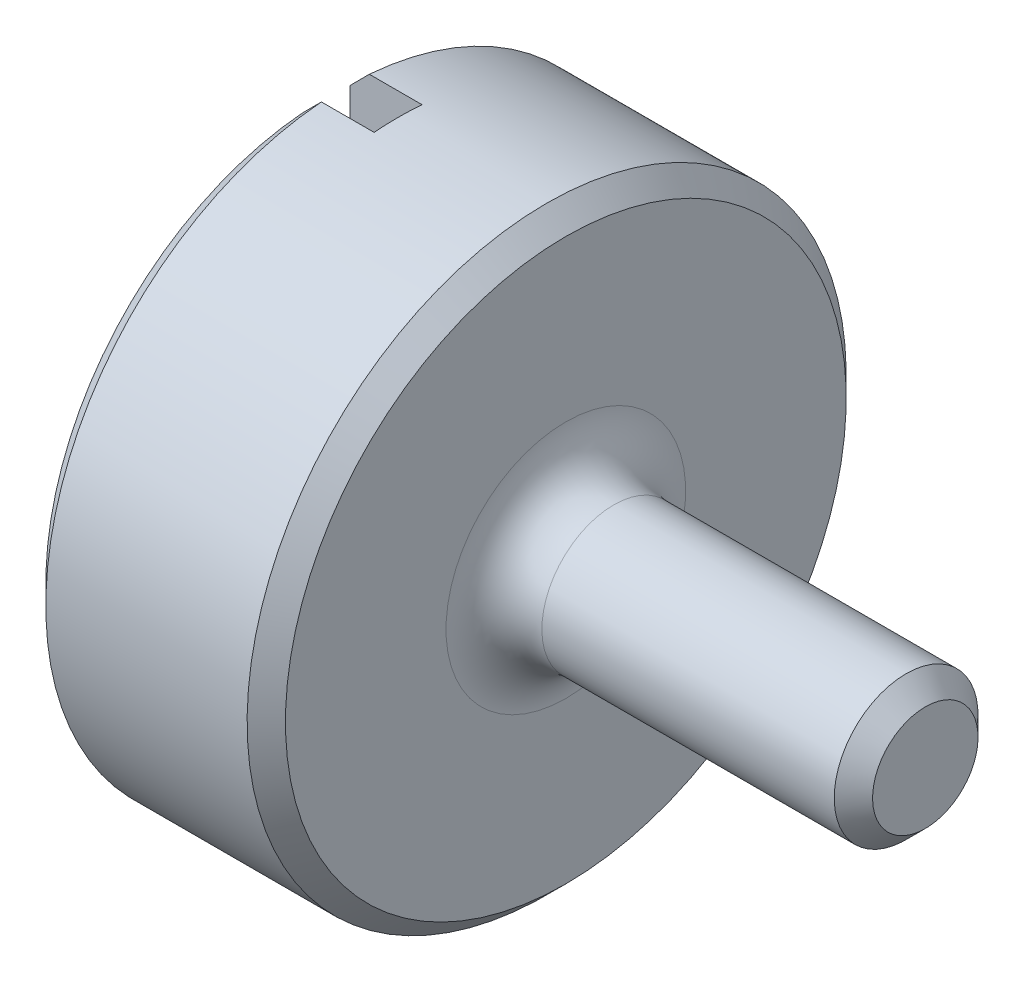
ISO-10303-21;
HEADER;
FILE_DESCRIPTION(('STEP AP214'),'2;1');
FILE_NAME('part.step','',(''),(''),'','','');
FILE_SCHEMA(('AUTOMOTIVE_DESIGN { 1 0 10303 214 1 1 1 1 }'));
ENDSEC;
DATA;
#1=APPLICATION_CONTEXT('core data for automotive mechanical design processes');
#2=APPLICATION_PROTOCOL_DEFINITION('international standard','automotive_design',2000,#1);
#3=PRODUCT_CONTEXT('',#1,'mechanical');
#4=PRODUCT('Part','Part','',(#3));
#5=PRODUCT_RELATED_PRODUCT_CATEGORY('part','',(#4));
#6=PRODUCT_DEFINITION_FORMATION('','',#4);
#7=PRODUCT_DEFINITION_CONTEXT('part definition',#1,'design');
#8=PRODUCT_DEFINITION('design','',#6,#7);
#9=PRODUCT_DEFINITION_SHAPE('','',#8);
#10=(LENGTH_UNIT() NAMED_UNIT(*) SI_UNIT(.MILLI.,.METRE.));
#11=(NAMED_UNIT(*) PLANE_ANGLE_UNIT() SI_UNIT($,.RADIAN.));
#12=(NAMED_UNIT(*) SI_UNIT($,.STERADIAN.) SOLID_ANGLE_UNIT());
#13=UNCERTAINTY_MEASURE_WITH_UNIT(LENGTH_MEASURE(1.E-05),#10,'distance_accuracy_value','');
#14=(GEOMETRIC_REPRESENTATION_CONTEXT(3) GLOBAL_UNCERTAINTY_ASSIGNED_CONTEXT((#13)) GLOBAL_UNIT_ASSIGNED_CONTEXT((#10,
#11,#12)) REPRESENTATION_CONTEXT('',''));
#15=CARTESIAN_POINT('',(0.,0.,0.));
#16=DIRECTION('',(0.,0.,1.));
#17=DIRECTION('',(1.,0.,0.));
#18=AXIS2_PLACEMENT_3D('',#15,#16,#17);
#19=CARTESIAN_POINT('',(0.,0.,0.));
#20=DIRECTION('',(-1.,0.,0.));
#21=DIRECTION('',(0.,-1.,0.));
#22=AXIS2_PLACEMENT_3D('',#19,#20,#21);
#23=PLANE('',#22);
#24=DIRECTION('',(0.,1.,0.));
#25=VECTOR('',#24,1.);
#26=CARTESIAN_POINT('',(0.,-15.,1.));
#27=LINE('',#26,#25);
#28=CARTESIAN_POINT('',(0.,-11.6571866245677,1.));
#29=VERTEX_POINT('',#28);
#30=CARTESIAN_POINT('',(0.,11.6571866245677,1.));
#31=VERTEX_POINT('',#30);
#32=EDGE_CURVE('E92',#29,#31,#27,.T.);
#33=ORIENTED_EDGE('',*,*,#32,.F.);
#34=CARTESIAN_POINT('',(0.,0.,0.));
#35=DIRECTION('',(-1.,0.,0.));
#36=DIRECTION('',(0.,-1.,0.));
#37=AXIS2_PLACEMENT_3D('',#34,#35,#36);
#38=CIRCLE('',#37,11.7);
#39=EDGE_CURVE('E101',#29,#31,#38,.T.);
#40=ORIENTED_EDGE('',*,*,#39,.T.);
#41=EDGE_LOOP('',(#33,#40));
#42=FACE_BOUND('',#41,.T.);
#43=ADVANCED_FACE('F39',(#42),#23,.T.);
#44=CARTESIAN_POINT('',(0.800000000000009,0.,0.));
#45=DIRECTION('',(1.,0.,0.));
#46=DIRECTION('',(0.,1.,0.));
#47=AXIS2_PLACEMENT_3D('',#44,#45,#46);
#48=CONICAL_SURFACE('',#47,12.5,0.785398163397451);
#49=CARTESIAN_POINT('',(15.807878034926,-27.4896954145434,1.));
#50=CARTESIAN_POINT('',(14.8555108146234,-26.536693146937,1.));
#51=CARTESIAN_POINT('',(13.9031715016769,-25.5836629846989,1.));
#52=CARTESIAN_POINT('',(11.9985833649203,-23.677508671348,1.));
#53=CARTESIAN_POINT('',(11.0463345412833,-22.7243845200622,1.));
#54=CARTESIAN_POINT('',(9.14192443533305,-20.8179663651652,1.));
#55=CARTESIAN_POINT('',(8.18976315859005,-19.8646723559894,1.));
#56=CARTESIAN_POINT('',(6.28563973653276,-17.9578889595549,1.));
#57=CARTESIAN_POINT('',(5.33367759085774,-17.0043995726564,1.));
#58=CARTESIAN_POINT('',(3.43645473458549,-15.1035030827972,1.));
#59=CARTESIAN_POINT('',(2.49119191092316,-14.1560980892298,1.));
#60=CARTESIAN_POINT('',(1.07371904234302,-12.7345650808275,1.));
#61=CARTESIAN_POINT('',(0.60129698355512,-12.260648489201,1.));
#62=CARTESIAN_POINT('',(-0.343344665598047,-11.3126140741084,1.));
#63=CARTESIAN_POINT('',(-0.815564256075536,-10.8384962507541,1.));
#64=CARTESIAN_POINT('',(-1.75969684490445,-9.88998054353987,1.));
#65=CARTESIAN_POINT('',(-2.23160985110072,-9.41558266749058,1.));
#66=CARTESIAN_POINT('',(-3.17497918924368,-8.46633104338289,1.));
#67=CARTESIAN_POINT('',(-3.64643552021582,-7.99147729435592,1.));
#68=CARTESIAN_POINT('',(-4.58859457239412,-7.04103122185077,1.));
#69=CARTESIAN_POINT('',(-5.05929730097755,-6.56543890569357,1.));
#70=CARTESIAN_POINT('',(-5.76428341950261,-5.85099794631025,1.));
#71=CARTESIAN_POINT('',(-5.99910039209437,-5.61267595806537,1.));
#72=CARTESIAN_POINT('',(-6.46821135319529,-5.1355179588062,1.));
#73=CARTESIAN_POINT('',(-6.70250534236055,-4.8966819484375,1.));
#74=CARTESIAN_POINT('',(-7.06481216676372,-4.52611496234965,1.));
#75=CARTESIAN_POINT('',(-7.19310419078454,-4.39465701635852,1.));
#76=CARTESIAN_POINT('',(-7.44937260011189,-4.13143310508605,1.));
#77=CARTESIAN_POINT('',(-7.57734898463796,-3.99966713904466,1.));
#78=CARTESIAN_POINT('',(-7.83300381811471,-3.73560676508893,1.));
#79=CARTESIAN_POINT('',(-7.96068187556511,-3.60331197772391,1.));
#80=CARTESIAN_POINT('',(-8.2154590637256,-3.33816767213829,1.));
#81=CARTESIAN_POINT('',(-8.34255819757996,-3.20531815693807,1.));
#82=CARTESIAN_POINT('',(-8.63890915551919,-2.8936809652707,1.));
#83=CARTESIAN_POINT('',(-8.80784266623338,-2.71458917149139,1.));
#84=CARTESIAN_POINT('',(-9.05921024867457,-2.44434894346446,1.));
#85=CARTESIAN_POINT('',(-9.14258907707747,-2.35408092473684,1.));
#86=CARTESIAN_POINT('',(-9.30846010774357,-2.1727407165089,1.));
#87=CARTESIAN_POINT('',(-9.3909523425628,-2.08166855676217,1.));
#88=CARTESIAN_POINT('',(-9.58240572956285,-1.86743064326045,1.));
#89=CARTESIAN_POINT('',(-9.69088316079781,-1.74382771077056,1.));
#90=CARTESIAN_POINT('',(-9.85097604119026,-1.55562239194343,1.));
#91=CARTESIAN_POINT('',(-9.90403721822307,-1.49225254848212,1.));
#92=CARTESIAN_POINT('',(-10.0087852867479,-1.36439004058006,1.));
#93=CARTESIAN_POINT('',(-10.0604722927906,-1.29989747047603,1.));
#94=CARTESIAN_POINT('',(-10.1624354567112,-1.16868824925741,1.));
#95=CARTESIAN_POINT('',(-10.2126906334983,-1.10195519518504,1.));
#96=CARTESIAN_POINT('',(-10.3102743734976,-0.966215584856913,1.));
#97=CARTESIAN_POINT('',(-10.3575989912019,-0.897206147409944,1.));
#98=CARTESIAN_POINT('',(-10.4471567135031,-0.756665935244809,1.));
#99=CARTESIAN_POINT('',(-10.489426101978,-0.685158572077686,1.));
#100=CARTESIAN_POINT('',(-10.5661430226153,-0.538097820372609,1.));
#101=CARTESIAN_POINT('',(-10.6006143053188,-0.462557607670071,1.));
#102=CARTESIAN_POINT('',(-10.6392251726816,-0.354967792280996,1.));
#103=CARTESIAN_POINT('',(-10.6489351484247,-0.324928911583501,1.));
#104=CARTESIAN_POINT('',(-10.6660973338667,-0.264214153066471,1.));
#105=CARTESIAN_POINT('',(-10.6735494683775,-0.233538254069978,1.));
#106=CARTESIAN_POINT('',(-10.6919063164554,-0.140944427066972,1.));
#107=CARTESIAN_POINT('',(-10.6989216057753,-0.0781718405835981,1.));
#108=CARTESIAN_POINT('',(-10.7008486773791,0.0478569629637886,1.));
#109=CARTESIAN_POINT('',(-10.6957013146907,0.111114046174777,1.));
#110=CARTESIAN_POINT('',(-10.6744238041197,0.235861919114412,1.));
#111=CARTESIAN_POINT('',(-10.6582543817528,0.297345570306663,1.));
#112=CARTESIAN_POINT('',(-10.6169329496841,0.420175900562732,1.));
#113=CARTESIAN_POINT('',(-10.5914086725897,0.481391312498021,1.));
#114=CARTESIAN_POINT('',(-10.5344551597917,0.601057449533538,1.));
#115=CARTESIAN_POINT('',(-10.5030149210655,0.659502764831655,1.));
#116=CARTESIAN_POINT('',(-10.4359946962556,0.774538295051341,1.));
#117=CARTESIAN_POINT('',(-10.4003844723781,0.831110589957209,1.));
#118=CARTESIAN_POINT('',(-10.3449870570802,0.914597355009349,1.));
#119=CARTESIAN_POINT('',(-10.3261990299114,0.94218661150767,1.));
#120=CARTESIAN_POINT('',(-10.2880616799861,0.996973875092047,1.));
#121=CARTESIAN_POINT('',(-10.2687123731191,1.02417189322134,1.));
#122=CARTESIAN_POINT('',(-10.206384907135,1.11020140978787,1.));
#123=CARTESIAN_POINT('',(-10.1625295518816,1.16839701885495,1.));
#124=CARTESIAN_POINT('',(-10.0732618131998,1.28358509428769,1.));
#125=CARTESIAN_POINT('',(-10.0278491866867,1.34057737055325,1.));
#126=CARTESIAN_POINT('',(-9.88990105290229,1.51024661668674,1.));
#127=CARTESIAN_POINT('',(-9.79569551651262,1.62156234578438,1.));
#128=CARTESIAN_POINT('',(-9.60460713326796,1.84218976879908,1.));
#129=CARTESIAN_POINT('',(-9.50771982032372,1.95149754390925,1.));
#130=CARTESIAN_POINT('',(-9.31237352548137,2.16864140574841,1.));
#131=CARTESIAN_POINT('',(-9.2139149958505,2.27647789997275,1.));
#132=CARTESIAN_POINT('',(-9.01624589935556,2.49083124071735,1.));
#133=CARTESIAN_POINT('',(-8.91703865838071,2.59735116476431,1.));
#134=CARTESIAN_POINT('',(-8.71787494643918,2.80970174269921,1.));
#135=CARTESIAN_POINT('',(-8.61791842262359,2.91553234696473,1.));
#136=CARTESIAN_POINT('',(-8.41757201418156,3.12656844533748,1.));
#137=CARTESIAN_POINT('',(-8.31718270235786,3.23177448385095,1.));
#138=CARTESIAN_POINT('',(-8.11600081772052,3.44179516554277,1.));
#139=CARTESIAN_POINT('',(-8.01520825465803,3.54660981806826,1.));
#140=CARTESIAN_POINT('',(-7.71325906172983,3.85968428159871,1.));
#141=CARTESIAN_POINT('',(-7.51164563019328,4.06750337618647,1.));
#142=CARTESIAN_POINT('',(-7.10765103010603,4.48239435067646,1.));
#143=CARTESIAN_POINT('',(-6.90526985849305,4.68946622759181,1.));
#144=CARTESIAN_POINT('',(-6.29735872916324,5.30994459715682,1.));
#145=CARTESIAN_POINT('',(-5.8910686812789,5.72260607308193,1.));
#146=CARTESIAN_POINT('',(-5.07729589805776,6.5470947833271,1.));
#147=CARTESIAN_POINT('',(-4.66981273019834,6.95892158993145,1.));
#148=CARTESIAN_POINT('',(-3.85424007487945,7.78196728918696,1.));
#149=CARTESIAN_POINT('',(-3.44615059272825,8.1931861870982,1.));
#150=CARTESIAN_POINT('',(-2.62954690368962,9.01528432110729,1.));
#151=CARTESIAN_POINT('',(-2.22103265809964,9.42616351874364,1.));
#152=CARTESIAN_POINT('',(-1.40374312707324,10.2476640891893,1.));
#153=CARTESIAN_POINT('',(-0.994967841033351,10.6582854613982,1.));
#154=CARTESIAN_POINT('',(0.231520024145323,11.8897725452021,1.));
#155=CARTESIAN_POINT('',(1.04950234000151,12.7103695825016,1.));
#156=CARTESIAN_POINT('',(3.02871000754743,14.694972414817,1.));
#157=CARTESIAN_POINT('',(4.19013045464783,15.8587835934129,1.));
#158=CARTESIAN_POINT('',(6.51341985056264,18.1860712809208,1.));
#159=CARTESIAN_POINT('',(7.67528881846152,19.3495477707782,1.));
#160=CARTESIAN_POINT('',(9.99889214984743,21.6759119122053,1.));
#161=CARTESIAN_POINT('',(11.1606264426887,22.8387996343411,1.));
#162=CARTESIAN_POINT('',(13.484187792837,25.1643687501421,1.));
#163=CARTESIAN_POINT('',(14.6460148428278,26.327050151117,1.));
#164=CARTESIAN_POINT('',(15.807878034926,27.4896954145434,1.));
#165=B_SPLINE_CURVE_WITH_KNOTS('',3,(#49,#50,#51,#52,#53,#54,#55,#56,#57,#58,#59,#60,#61,#62,
#63,#64,#65,#66,#67,#68,#69,#70,#71,#72,#73,#74,#75,#76,#77,#78,#79,#80,#81,#82,#83,#84,#85,#86,
#87,#88,#89,#90,#91,#92,#93,#94,#95,#96,#97,#98,#99,#100,#101,#102,#103,#104,#105,#106,#107,
#108,#109,#110,#111,#112,#113,#114,#115,#116,#117,#118,#119,#120,#121,#122,#123,#124,#125,#126,
#127,#128,#129,#130,#131,#132,#133,#134,#135,#136,#137,#138,#139,#140,#141,#142,#143,#144,#145,
#146,#147,#148,#149,#150,#151,#152,#153,#154,#155,#156,#157,#158,#159,#160,#161,#162,#163,#164),
.UNSPECIFIED.,.F.,.F.,(4,2,2,2,2,2,2,2,2,2,2,2,2,2,2,2,2,2,2,2,2,2,2,2,2,2,2,2,2,2,2,2,2,2,2,2,
2,2,2,2,2,2,2,2,2,2,2,2,2,2,2,2,2,2,2,2,2,4),(0.,4.04189928658942,8.08380616057433,
12.125887915259,16.167962283066,20.1829194401768,22.1904093306113,24.1978981069374,
26.2053333156475,28.2127727988613,30.2201925089327,31.2238988978735,32.2276040269417,
32.7786574439358,33.3297122221212,33.8812833133612,34.4328514053105,35.1714225765971,
35.5400679298337,35.9086996997112,36.4020041126186,36.6499449769294,36.8978651076948,
37.1484347689425,37.3993347573289,37.6483094216116,37.8965152613873,37.9911444901538,
38.085776869815,38.2741257790931,38.4633924816035,38.6533371407652,38.8518493509875,
39.0507344878249,39.2511633333379,39.3512955218455,39.4514248784183,39.6699918658093,
39.8885931274618,40.3259966666078,40.764178589341,41.2022365805922,41.6389210745349,
42.0756366643737,42.5118885717047,42.9481299928897,43.8167635668119,44.685400609117,
46.4227071105011,48.1607499520093,49.8987776656053,51.636980758931,53.3751878851962,
56.8511437437272,61.783707331895,66.7165110911253,71.6477796534,76.5788070290373),.UNSPECIFIED.);
#166=CARTESIAN_POINT('',(0.800000000000009,-12.4599357943771,1.));
#167=VERTEX_POINT('',#166);
#168=EDGE_CURVE('E89',#167,#29,#165,.T.);
#169=ORIENTED_EDGE('',*,*,#168,.F.);
#170=CARTESIAN_POINT('',(0.800000000000009,0.,0.));
#171=DIRECTION('',(-1.,0.,0.));
#172=DIRECTION('',(0.,-1.,0.));
#173=AXIS2_PLACEMENT_3D('',#170,#171,#172);
#174=CIRCLE('',#173,12.5);
#175=CARTESIAN_POINT('',(0.800000000000009,12.4599357943771,1.));
#176=VERTEX_POINT('',#175);
#177=EDGE_CURVE('E241',#176,#167,#174,.F.);
#178=ORIENTED_EDGE('',*,*,#177,.F.);
#179=EDGE_CURVE('E98',#31,#176,#165,.T.);
#180=ORIENTED_EDGE('',*,*,#179,.F.);
#181=ORIENTED_EDGE('',*,*,#39,.F.);
#182=EDGE_LOOP('',(#169,#178,#180,#181));
#183=FACE_BOUND('',#182,.T.);
#184=ADVANCED_FACE('F103',(#183),#48,.T.);
#185=DIRECTION('',(0.,-1.,0.));
#186=VECTOR('',#185,1.);
#187=CARTESIAN_POINT('',(0.,-15.,-1.));
#188=LINE('',#187,#186);
#189=CARTESIAN_POINT('',(0.,11.6571866245677,-1.));
#190=VERTEX_POINT('',#189);
#191=CARTESIAN_POINT('',(0.,-11.6571866245677,-1.));
#192=VERTEX_POINT('',#191);
#193=EDGE_CURVE('E54',#190,#192,#188,.T.);
#194=ORIENTED_EDGE('',*,*,#193,.F.);
#195=EDGE_CURVE('E105',#190,#192,#38,.T.);
#196=ORIENTED_EDGE('',*,*,#195,.T.);
#197=EDGE_LOOP('',(#194,#196));
#198=FACE_BOUND('',#197,.T.);
#199=ADVANCED_FACE('F165',(#198),#23,.T.);
#200=CARTESIAN_POINT('',(25.,0.,0.));
#201=DIRECTION('',(1.,0.,0.));
#202=DIRECTION('',(0.,1.,0.));
#203=AXIS2_PLACEMENT_3D('',#200,#201,#202);
#204=CYLINDRICAL_SURFACE('',#203,12.5);
#205=DIRECTION('',(1.,0.,0.));
#206=VECTOR('',#205,1.);
#207=CARTESIAN_POINT('',(25.,-12.4599357943771,1.));
#208=LINE('',#207,#206);
#209=CARTESIAN_POINT('',(3.,-12.4599357943771,1.));
#210=VERTEX_POINT('',#209);
#211=EDGE_CURVE('E62',#210,#167,#208,.F.);
#212=ORIENTED_EDGE('',*,*,#211,.F.);
#213=CARTESIAN_POINT('',(3.,0.,0.));
#214=DIRECTION('',(1.,0.,0.));
#215=DIRECTION('',(0.,1.,0.));
#216=AXIS2_PLACEMENT_3D('',#213,#214,#215);
#217=CIRCLE('',#216,12.5);
#218=CARTESIAN_POINT('',(3.,-12.4599357943771,-1.));
#219=VERTEX_POINT('',#218);
#220=EDGE_CURVE('E11',#219,#210,#217,.F.);
#221=ORIENTED_EDGE('',*,*,#220,.F.);
#222=DIRECTION('',(1.,0.,0.));
#223=VECTOR('',#222,1.);
#224=CARTESIAN_POINT('',(25.,-12.4599357943771,-1.));
#225=LINE('',#224,#223);
#226=CARTESIAN_POINT('',(0.800000000000009,-12.4599357943771,-1.));
#227=VERTEX_POINT('',#226);
#228=EDGE_CURVE('E249',#227,#219,#225,.T.);
#229=ORIENTED_EDGE('',*,*,#228,.F.);
#230=CARTESIAN_POINT('',(0.800000000000008,12.4599357943771,-1.));
#231=VERTEX_POINT('',#230);
#232=EDGE_CURVE('E111',#227,#231,#174,.F.);
#233=ORIENTED_EDGE('',*,*,#232,.T.);
#234=DIRECTION('',(1.,0.,0.));
#235=VECTOR('',#234,1.);
#236=CARTESIAN_POINT('',(25.,12.4599357943771,-1.));
#237=LINE('',#236,#235);
#238=CARTESIAN_POINT('',(3.,12.4599357943771,-1.));
#239=VERTEX_POINT('',#238);
#240=EDGE_CURVE('E245',#239,#231,#237,.F.);
#241=ORIENTED_EDGE('',*,*,#240,.F.);
#242=CARTESIAN_POINT('',(3.,12.4599357943771,1.));
#243=VERTEX_POINT('',#242);
#244=EDGE_CURVE('E43',#243,#239,#217,.F.);
#245=ORIENTED_EDGE('',*,*,#244,.F.);
#246=DIRECTION('',(1.,0.,0.));
#247=VECTOR('',#246,1.);
#248=CARTESIAN_POINT('',(25.,12.4599357943771,1.));
#249=LINE('',#248,#247);
#250=EDGE_CURVE('E238',#176,#243,#249,.T.);
#251=ORIENTED_EDGE('',*,*,#250,.F.);
#252=ORIENTED_EDGE('',*,*,#177,.T.);
#253=EDGE_LOOP('',(#212,#221,#229,#233,#241,#245,#251,#252));
#254=FACE_BOUND('',#253,.T.);
#255=CARTESIAN_POINT('',(9.19999999999999,0.,0.));
#256=DIRECTION('',(1.,0.,0.));
#257=DIRECTION('',(0.,1.,0.));
#258=AXIS2_PLACEMENT_3D('',#255,#256,#257);
#259=CIRCLE('',#258,12.5);
#260=CARTESIAN_POINT('',(9.19999999999999,12.5,0.));
#261=VERTEX_POINT('',#260);
#262=EDGE_CURVE('E242',#261,#261,#259,.F.);
#263=ORIENTED_EDGE('',*,*,#262,.T.);
#264=EDGE_LOOP('',(#263));
#265=FACE_BOUND('',#264,.T.);
#266=ADVANCED_FACE('F162',(#254,#265),#204,.T.);
#267=CARTESIAN_POINT('',(10.,12.5,0.));
#268=DIRECTION('',(1.,0.,0.));
#269=DIRECTION('',(0.,1.,0.));
#270=AXIS2_PLACEMENT_3D('',#267,#268,#269);
#271=PLANE('',#270);
#272=CARTESIAN_POINT('',(10.,0.,0.));
#273=DIRECTION('',(1.,0.,0.));
#274=DIRECTION('',(0.,1.,0.));
#275=AXIS2_PLACEMENT_3D('',#272,#273,#274);
#276=CIRCLE('',#275,5.);
#277=CARTESIAN_POINT('',(10.,5.,0.));
#278=VERTEX_POINT('',#277);
#279=EDGE_CURVE('E123',#278,#278,#276,.F.);
#280=ORIENTED_EDGE('',*,*,#279,.T.);
#281=EDGE_LOOP('',(#280));
#282=FACE_BOUND('',#281,.T.);
#283=CARTESIAN_POINT('',(10.,0.,0.));
#284=DIRECTION('',(1.,0.,0.));
#285=DIRECTION('',(0.,1.,0.));
#286=AXIS2_PLACEMENT_3D('',#283,#284,#285);
#287=CIRCLE('',#286,11.7);
#288=CARTESIAN_POINT('',(10.,11.7,0.));
#289=VERTEX_POINT('',#288);
#290=EDGE_CURVE('E104',#289,#289,#287,.T.);
#291=ORIENTED_EDGE('',*,*,#290,.T.);
#292=EDGE_LOOP('',(#291));
#293=FACE_BOUND('',#292,.T.);
#294=ADVANCED_FACE('F158',(#282,#293),#271,.T.);
#295=CARTESIAN_POINT('',(25.,0.,0.));
#296=DIRECTION('',(1.,0.,0.));
#297=DIRECTION('',(0.,1.,0.));
#298=AXIS2_PLACEMENT_3D('',#295,#296,#297);
#299=CYLINDRICAL_SURFACE('',#298,3.);
#300=CARTESIAN_POINT('',(12.,0.,0.));
#301=DIRECTION('',(1.,0.,0.));
#302=DIRECTION('',(0.,1.,0.));
#303=AXIS2_PLACEMENT_3D('',#300,#301,#302);
#304=CIRCLE('',#303,3.);
#305=CARTESIAN_POINT('',(12.,3.,0.));
#306=VERTEX_POINT('',#305);
#307=EDGE_CURVE('E120',#306,#306,#304,.T.);
#308=ORIENTED_EDGE('',*,*,#307,.T.);
#309=EDGE_LOOP('',(#308));
#310=FACE_BOUND('',#309,.T.);
#311=CARTESIAN_POINT('',(24.2,0.,0.));
#312=DIRECTION('',(1.,0.,0.));
#313=DIRECTION('',(0.,1.,0.));
#314=AXIS2_PLACEMENT_3D('',#311,#312,#313);
#315=CIRCLE('',#314,3.);
#316=CARTESIAN_POINT('',(24.2,3.,0.));
#317=VERTEX_POINT('',#316);
#318=EDGE_CURVE('E117',#317,#317,#315,.F.);
#319=ORIENTED_EDGE('',*,*,#318,.T.);
#320=EDGE_LOOP('',(#319));
#321=FACE_BOUND('',#320,.T.);
#322=ADVANCED_FACE('F154',(#310,#321),#299,.T.);
#323=CARTESIAN_POINT('',(25.,3.,0.));
#324=DIRECTION('',(1.,0.,0.));
#325=DIRECTION('',(0.,1.,0.));
#326=AXIS2_PLACEMENT_3D('',#323,#324,#325);
#327=PLANE('',#326);
#328=CARTESIAN_POINT('',(25.,0.,0.));
#329=DIRECTION('',(1.,0.,0.));
#330=DIRECTION('',(0.,1.,0.));
#331=AXIS2_PLACEMENT_3D('',#328,#329,#330);
#332=CIRCLE('',#331,2.2);
#333=CARTESIAN_POINT('',(25.,2.2,0.));
#334=VERTEX_POINT('',#333);
#335=EDGE_CURVE('E108',#334,#334,#332,.T.);
#336=ORIENTED_EDGE('',*,*,#335,.T.);
#337=EDGE_LOOP('',(#336));
#338=FACE_BOUND('',#337,.T.);
#339=ADVANCED_FACE('F151',(#338),#327,.T.);
#340=CARTESIAN_POINT('',(15.807878034926,27.4896954145434,-1.));
#341=CARTESIAN_POINT('',(14.8555108146234,26.536693146937,-1.));
#342=CARTESIAN_POINT('',(13.9031715016769,25.5836629846988,-1.));
#343=CARTESIAN_POINT('',(11.9985833649203,23.677508671348,-1.));
#344=CARTESIAN_POINT('',(11.0463345412833,22.7243845200622,-1.));
#345=CARTESIAN_POINT('',(9.14192443533305,20.8179663651652,-1.));
#346=CARTESIAN_POINT('',(8.18976315859004,19.8646723559894,-1.));
#347=CARTESIAN_POINT('',(6.28563973653275,17.9578889595549,-1.));
#348=CARTESIAN_POINT('',(5.33367759085773,17.0043995726564,-1.));
#349=CARTESIAN_POINT('',(3.43645473458548,15.1035030827972,-1.));
#350=CARTESIAN_POINT('',(2.49119191092315,14.1560980892298,-1.));
#351=CARTESIAN_POINT('',(1.07371904234301,12.7345650808275,-1.));
#352=CARTESIAN_POINT('',(0.601296983555115,12.260648489201,-1.));
#353=CARTESIAN_POINT('',(-0.34334466559805,11.3126140741084,-1.));
#354=CARTESIAN_POINT('',(-0.815564256075537,10.8384962507541,-1.));
#355=CARTESIAN_POINT('',(-1.75969684490445,9.88998054353987,-1.));
#356=CARTESIAN_POINT('',(-2.23160985110072,9.41558266749058,-1.));
#357=CARTESIAN_POINT('',(-3.17497918924368,8.46633104338288,-1.));
#358=CARTESIAN_POINT('',(-3.64643552021582,7.99147729435592,-1.));
#359=CARTESIAN_POINT('',(-4.58859457239413,7.04103122185077,-1.));
#360=CARTESIAN_POINT('',(-5.05929730097755,6.56543890569357,-1.));
#361=CARTESIAN_POINT('',(-5.76428341950261,5.85099794631025,-1.));
#362=CARTESIAN_POINT('',(-5.99910039209437,5.61267595806537,-1.));
#363=CARTESIAN_POINT('',(-6.46821135319529,5.1355179588062,-1.));
#364=CARTESIAN_POINT('',(-6.70250534236055,4.8966819484375,-1.));
#365=CARTESIAN_POINT('',(-7.06481216676372,4.52611496234965,-1.));
#366=CARTESIAN_POINT('',(-7.19310419078454,4.39465701635852,-1.));
#367=CARTESIAN_POINT('',(-7.44937260011189,4.13143310508605,-1.));
#368=CARTESIAN_POINT('',(-7.57734898463796,3.99966713904466,-1.));
#369=CARTESIAN_POINT('',(-7.83300381811471,3.73560676508893,-1.));
#370=CARTESIAN_POINT('',(-7.96068187556511,3.60331197772391,-1.));
#371=CARTESIAN_POINT('',(-8.2154590637256,3.33816767213829,-1.));
#372=CARTESIAN_POINT('',(-8.34255819757996,3.20531815693808,-1.));
#373=CARTESIAN_POINT('',(-8.63890915551918,2.8936809652707,-1.));
#374=CARTESIAN_POINT('',(-8.80784266623338,2.7145891714914,-1.));
#375=CARTESIAN_POINT('',(-9.05921024867457,2.44434894346446,-1.));
#376=CARTESIAN_POINT('',(-9.14258907707746,2.35408092473685,-1.));
#377=CARTESIAN_POINT('',(-9.30846010774356,2.17274071650891,-1.));
#378=CARTESIAN_POINT('',(-9.39095234256279,2.08166855676217,-1.));
#379=CARTESIAN_POINT('',(-9.58240572956285,1.86743064326045,-1.));
#380=CARTESIAN_POINT('',(-9.69088316079781,1.74382771077056,-1.));
#381=CARTESIAN_POINT('',(-9.85097604119026,1.55562239194344,-1.));
#382=CARTESIAN_POINT('',(-9.90403721822307,1.49225254848213,-1.));
#383=CARTESIAN_POINT('',(-10.0087852867479,1.36439004058006,-1.));
#384=CARTESIAN_POINT('',(-10.0604722927906,1.29989747047603,-1.));
#385=CARTESIAN_POINT('',(-10.1624354567112,1.16868824925741,-1.));
#386=CARTESIAN_POINT('',(-10.2126906334983,1.10195519518504,-1.));
#387=CARTESIAN_POINT('',(-10.3102743734976,0.966215584856912,-1.));
#388=CARTESIAN_POINT('',(-10.3575989912019,0.897206147409944,-1.));
#389=CARTESIAN_POINT('',(-10.4471567135031,0.756665935244808,-1.));
#390=CARTESIAN_POINT('',(-10.489426101978,0.685158572077683,-1.));
#391=CARTESIAN_POINT('',(-10.5661430226153,0.538097820372606,-1.));
#392=CARTESIAN_POINT('',(-10.6006143053188,0.462557607670068,-1.));
#393=CARTESIAN_POINT('',(-10.6392251726816,0.354967792280997,-1.));
#394=CARTESIAN_POINT('',(-10.6489351484247,0.324928911583504,-1.));
#395=CARTESIAN_POINT('',(-10.6660973338667,0.264214153066476,-1.));
#396=CARTESIAN_POINT('',(-10.6735494683775,0.233538254069984,-1.));
#397=CARTESIAN_POINT('',(-10.6919063164554,0.140944427066975,-1.));
#398=CARTESIAN_POINT('',(-10.6989216057753,0.0781718405835989,-1.));
#399=CARTESIAN_POINT('',(-10.7008486773791,-0.0478569629637877,-1.));
#400=CARTESIAN_POINT('',(-10.6957013146907,-0.111114046174773,-1.));
#401=CARTESIAN_POINT('',(-10.6744238041197,-0.235861919114409,-1.));
#402=CARTESIAN_POINT('',(-10.6582543817528,-0.297345570306663,-1.));
#403=CARTESIAN_POINT('',(-10.6169329496841,-0.420175900562734,-1.));
#404=CARTESIAN_POINT('',(-10.5914086725897,-0.481391312498023,-1.));
#405=CARTESIAN_POINT('',(-10.5344551597917,-0.601057449533544,-1.));
#406=CARTESIAN_POINT('',(-10.5030149210655,-0.659502764831663,-1.));
#407=CARTESIAN_POINT('',(-10.4359946962556,-0.774538295051351,-1.));
#408=CARTESIAN_POINT('',(-10.4003844723781,-0.831110589957216,-1.));
#409=CARTESIAN_POINT('',(-10.3449870570802,-0.914597355009355,-1.));
#410=CARTESIAN_POINT('',(-10.3261990299114,-0.942186611507676,-1.));
#411=CARTESIAN_POINT('',(-10.2880616799861,-0.996973875092052,-1.));
#412=CARTESIAN_POINT('',(-10.2687123731191,-1.02417189322134,-1.));
#413=CARTESIAN_POINT('',(-10.206384907135,-1.11020140978788,-1.));
#414=CARTESIAN_POINT('',(-10.1625295518816,-1.16839701885496,-1.));
#415=CARTESIAN_POINT('',(-10.0732618131998,-1.2835850942877,-1.));
#416=CARTESIAN_POINT('',(-10.0278491866867,-1.34057737055325,-1.));
#417=CARTESIAN_POINT('',(-9.88990105290229,-1.51024661668675,-1.));
#418=CARTESIAN_POINT('',(-9.79569551651262,-1.62156234578439,-1.));
#419=CARTESIAN_POINT('',(-9.60460713326796,-1.84218976879909,-1.));
#420=CARTESIAN_POINT('',(-9.50771982032371,-1.95149754390925,-1.));
#421=CARTESIAN_POINT('',(-9.31237352548136,-2.16864140574841,-1.));
#422=CARTESIAN_POINT('',(-9.21391499585049,-2.27647789997277,-1.));
#423=CARTESIAN_POINT('',(-9.01624589935555,-2.49083124071737,-1.));
#424=CARTESIAN_POINT('',(-8.9170386583807,-2.59735116476433,-1.));
#425=CARTESIAN_POINT('',(-8.71787494643917,-2.80970174269923,-1.));
#426=CARTESIAN_POINT('',(-8.61791842262357,-2.91553234696475,-1.));
#427=CARTESIAN_POINT('',(-8.41757201418154,-3.1265684453375,-1.));
#428=CARTESIAN_POINT('',(-8.31718270235784,-3.23177448385097,-1.));
#429=CARTESIAN_POINT('',(-8.1160008177205,-3.44179516554279,-1.));
#430=CARTESIAN_POINT('',(-8.01520825465801,-3.54660981806828,-1.));
#431=CARTESIAN_POINT('',(-7.71325906172981,-3.85968428159874,-1.));
#432=CARTESIAN_POINT('',(-7.51164563019325,-4.0675033761865,-1.));
#433=CARTESIAN_POINT('',(-7.107651030106,-4.48239435067649,-1.));
#434=CARTESIAN_POINT('',(-6.90526985849302,-4.68946622759184,-1.));
#435=CARTESIAN_POINT('',(-6.29735872916321,-5.30994459715685,-1.));
#436=CARTESIAN_POINT('',(-5.89106868127886,-5.72260607308197,-1.));
#437=CARTESIAN_POINT('',(-5.07729589805771,-6.54709478332715,-1.));
#438=CARTESIAN_POINT('',(-4.66981273019829,-6.9589215899315,-1.));
#439=CARTESIAN_POINT('',(-3.85424007487939,-7.78196728918702,-1.));
#440=CARTESIAN_POINT('',(-3.44615059272819,-8.19318618709826,-1.));
#441=CARTESIAN_POINT('',(-2.62954690368956,-9.01528432110736,-1.));
#442=CARTESIAN_POINT('',(-2.22103265809957,-9.42616351874371,-1.));
#443=CARTESIAN_POINT('',(-1.40374312707316,-10.2476640891894,-1.));
#444=CARTESIAN_POINT('',(-0.994967841033276,-10.6582854613983,-1.));
#445=CARTESIAN_POINT('',(0.231520024145406,-11.8897725452022,-1.));
#446=CARTESIAN_POINT('',(1.0495023400016,-12.7103695825017,-1.));
#447=CARTESIAN_POINT('',(3.02871000754752,-14.6949724148171,-1.));
#448=CARTESIAN_POINT('',(4.19013045464791,-15.858783593413,-1.));
#449=CARTESIAN_POINT('',(6.5134198505627,-18.1860712809209,-1.));
#450=CARTESIAN_POINT('',(7.67528881846157,-19.3495477707783,-1.));
#451=CARTESIAN_POINT('',(9.99889214984747,-21.6759119122053,-1.));
#452=CARTESIAN_POINT('',(11.1606264426887,-22.8387996343411,-1.));
#453=CARTESIAN_POINT('',(13.484187792837,-25.1643687501421,-1.));
#454=CARTESIAN_POINT('',(14.6460148428278,-26.3270501511171,-1.));
#455=CARTESIAN_POINT('',(15.807878034926,-27.4896954145434,-1.));
#456=B_SPLINE_CURVE_WITH_KNOTS('',3,(#340,#341,#342,#343,#344,#345,#346,#347,#348,#349,#350,
#351,#352,#353,#354,#355,#356,#357,#358,#359,#360,#361,#362,#363,#364,#365,#366,#367,#368,#369,
#370,#371,#372,#373,#374,#375,#376,#377,#378,#379,#380,#381,#382,#383,#384,#385,#386,#387,#388,
#389,#390,#391,#392,#393,#394,#395,#396,#397,#398,#399,#400,#401,#402,#403,#404,#405,#406,#407,
#408,#409,#410,#411,#412,#413,#414,#415,#416,#417,#418,#419,#420,#421,#422,#423,#424,#425,#426,
#427,#428,#429,#430,#431,#432,#433,#434,#435,#436,#437,#438,#439,#440,#441,#442,#443,#444,#445,
#446,#447,#448,#449,#450,#451,#452,#453,#454,#455),.UNSPECIFIED.,.F.,.F.,(4,2,2,2,2,2,2,2,2,2,2,
2,2,2,2,2,2,2,2,2,2,2,2,2,2,2,2,2,2,2,2,2,2,2,2,2,2,2,2,2,2,2,2,2,2,2,2,2,2,2,2,2,2,2,2,2,2,4),
(0.,4.04189928658943,8.08380616057434,12.125887915259,16.167962283066,20.1829194401768,
22.1904093306113,24.1978981069374,26.2053333156475,28.2127727988613,30.2201925089327,
31.2238988978735,32.2276040269417,32.7786574439358,33.3297122221212,33.8812833133611,
34.4328514053105,35.1714225765971,35.5400679298336,35.9086996997112,36.4020041126185,
36.6499449769294,36.8978651076947,37.1484347689425,37.3993347573288,37.6483094216116,
37.8965152613873,37.9911444901538,38.0857768698149,38.2741257790931,38.4633924816035,
38.6533371407652,38.8518493509875,39.0507344878249,39.2511633333379,39.3512955218455,
39.4514248784182,39.6699918658093,39.8885931274618,40.3259966666078,40.764178589341,
41.2022365805922,41.6389210745349,42.0756366643737,42.5118885717047,42.9481299928897,
43.8167635668119,44.685400609117,46.4227071105011,48.1607499520093,49.8987776656054,
51.6369807589311,53.3751878851963,56.8511437437273,61.783707331895,66.7165110911253,
71.6477796534,76.5788070290373),.UNSPECIFIED.);
#457=EDGE_CURVE('E133',#231,#190,#456,.T.);
#458=ORIENTED_EDGE('',*,*,#457,.F.);
#459=ORIENTED_EDGE('',*,*,#232,.F.);
#460=EDGE_CURVE('E126',#192,#227,#456,.T.);
#461=ORIENTED_EDGE('',*,*,#460,.F.);
#462=ORIENTED_EDGE('',*,*,#195,.F.);
#463=EDGE_LOOP('',(#458,#459,#461,#462));
#464=FACE_BOUND('',#463,.T.);
#465=ADVANCED_FACE('F139',(#464),#48,.T.);
#466=CARTESIAN_POINT('',(10.,0.,0.));
#467=DIRECTION('',(-1.,0.,0.));
#468=DIRECTION('',(0.,-1.,0.));
#469=AXIS2_PLACEMENT_3D('',#466,#467,#468);
#470=CONICAL_SURFACE('',#469,11.7,0.785398163397446);
#471=ORIENTED_EDGE('',*,*,#262,.F.);
#472=EDGE_LOOP('',(#471));
#473=FACE_BOUND('',#472,.T.);
#474=ORIENTED_EDGE('',*,*,#290,.F.);
#475=EDGE_LOOP('',(#474));
#476=FACE_BOUND('',#475,.T.);
#477=ADVANCED_FACE('F201',(#473,#476),#470,.T.);
#478=CARTESIAN_POINT('',(25.,0.,0.));
#479=DIRECTION('',(-1.,0.,0.));
#480=DIRECTION('',(0.,-1.,0.));
#481=AXIS2_PLACEMENT_3D('',#478,#479,#480);
#482=CONICAL_SURFACE('',#481,2.2,0.78539816339745);
#483=ORIENTED_EDGE('',*,*,#318,.F.);
#484=EDGE_LOOP('',(#483));
#485=FACE_BOUND('',#484,.T.);
#486=ORIENTED_EDGE('',*,*,#335,.F.);
#487=EDGE_LOOP('',(#486));
#488=FACE_BOUND('',#487,.T.);
#489=ADVANCED_FACE('F260',(#485,#488),#482,.T.);
#490=CARTESIAN_POINT('',(12.,0.,0.));
#491=DIRECTION('',(1.,0.,0.));
#492=DIRECTION('',(0.,1.,0.));
#493=AXIS2_PLACEMENT_3D('',#490,#491,#492);
#494=TOROIDAL_SURFACE('',#493,5.,2.);
#495=ORIENTED_EDGE('',*,*,#279,.F.);
#496=EDGE_LOOP('',(#495));
#497=FACE_BOUND('',#496,.T.);
#498=ORIENTED_EDGE('',*,*,#307,.F.);
#499=EDGE_LOOP('',(#498));
#500=FACE_BOUND('',#499,.T.);
#501=ADVANCED_FACE('F41',(#497,#500),#494,.F.);
#502=CARTESIAN_POINT('',(3.,-15.,1.));
#503=DIRECTION('',(0.,0.,1.));
#504=DIRECTION('',(1.,0.,0.));
#505=AXIS2_PLACEMENT_3D('',#502,#503,#504);
#506=PLANE('',#505);
#507=ORIENTED_EDGE('',*,*,#211,.T.);
#508=ORIENTED_EDGE('',*,*,#168,.T.);
#509=ORIENTED_EDGE('',*,*,#32,.T.);
#510=ORIENTED_EDGE('',*,*,#179,.T.);
#511=ORIENTED_EDGE('',*,*,#250,.T.);
#512=DIRECTION('',(0.,1.,0.));
#513=VECTOR('',#512,1.);
#514=CARTESIAN_POINT('',(3.,-15.,1.));
#515=LINE('',#514,#513);
#516=EDGE_CURVE('E232',#210,#243,#515,.T.);
#517=ORIENTED_EDGE('',*,*,#516,.F.);
#518=EDGE_LOOP('',(#507,#508,#509,#510,#511,#517));
#519=FACE_BOUND('',#518,.T.);
#520=ADVANCED_FACE('F91',(#519),#506,.F.);
#521=CARTESIAN_POINT('',(3.,-15.,-1.));
#522=DIRECTION('',(0.,0.,-1.));
#523=DIRECTION('',(-1.,0.,0.));
#524=AXIS2_PLACEMENT_3D('',#521,#522,#523);
#525=PLANE('',#524);
#526=ORIENTED_EDGE('',*,*,#240,.T.);
#527=ORIENTED_EDGE('',*,*,#457,.T.);
#528=ORIENTED_EDGE('',*,*,#193,.T.);
#529=ORIENTED_EDGE('',*,*,#460,.T.);
#530=ORIENTED_EDGE('',*,*,#228,.T.);
#531=DIRECTION('',(0.,-1.,0.));
#532=VECTOR('',#531,1.);
#533=CARTESIAN_POINT('',(3.,-15.,-1.));
#534=LINE('',#533,#532);
#535=EDGE_CURVE('E235',#239,#219,#534,.T.);
#536=ORIENTED_EDGE('',*,*,#535,.F.);
#537=EDGE_LOOP('',(#526,#527,#528,#529,#530,#536));
#538=FACE_BOUND('',#537,.T.);
#539=ADVANCED_FACE('F143',(#538),#525,.F.);
#540=CARTESIAN_POINT('',(3.,15.,1.));
#541=DIRECTION('',(1.,0.,0.));
#542=DIRECTION('',(0.,1.,0.));
#543=AXIS2_PLACEMENT_3D('',#540,#541,#542);
#544=PLANE('',#543);
#545=ORIENTED_EDGE('',*,*,#220,.T.);
#546=ORIENTED_EDGE('',*,*,#516,.T.);
#547=ORIENTED_EDGE('',*,*,#244,.T.);
#548=ORIENTED_EDGE('',*,*,#535,.T.);
#549=EDGE_LOOP('',(#545,#546,#547,#548));
#550=FACE_BOUND('',#549,.T.);
#551=ADVANCED_FACE('F147',(#550),#544,.F.);
#552=CLOSED_SHELL('',(#43,#184,#199,#266,#294,#322,#339,#465,#477,#489,#501,#520,#539,#551));
#553=MANIFOLD_SOLID_BREP('B2',#552);
#554=ADVANCED_BREP_SHAPE_REPRESENTATION('',(#18,#553),#14);
#555=SHAPE_DEFINITION_REPRESENTATION(#9,#554);
ENDSEC;
END-ISO-10303-21;
